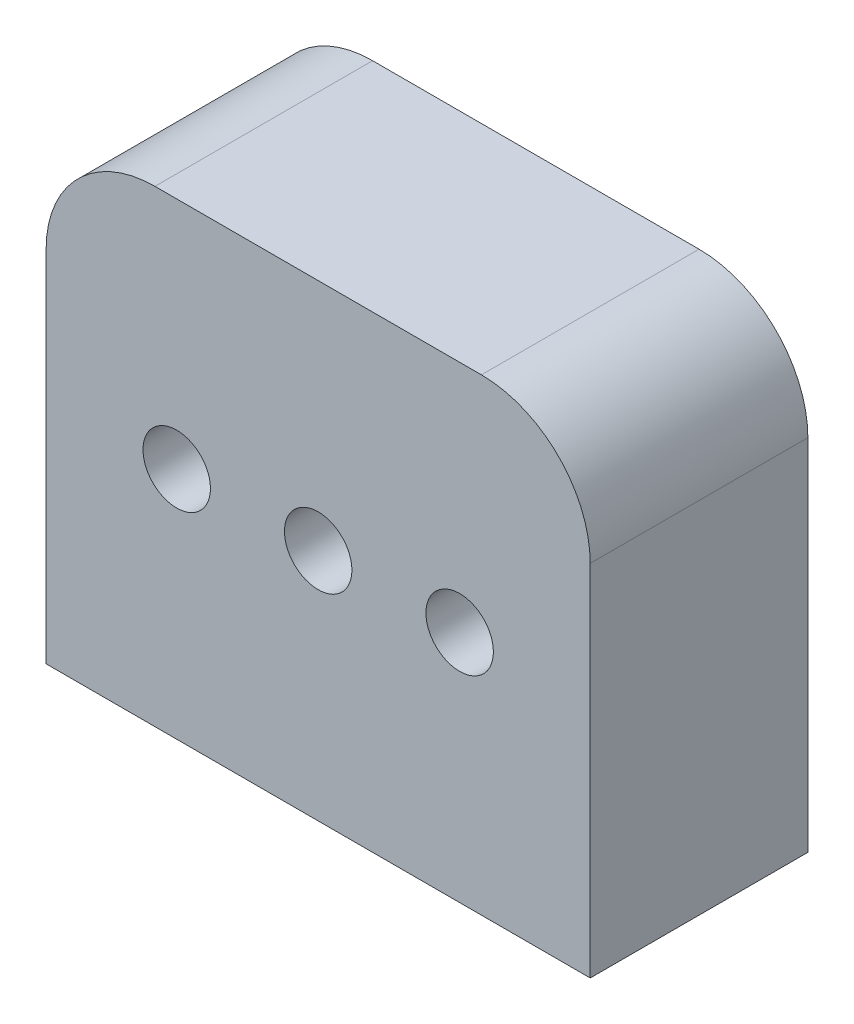
ISO-10303-21;
HEADER;
FILE_DESCRIPTION(('STEP AP214'),'2;1');
FILE_NAME('part.step','',(''),(''),'','','');
FILE_SCHEMA(('AUTOMOTIVE_DESIGN { 1 0 10303 214 1 1 1 1 }'));
ENDSEC;
DATA;
#1=APPLICATION_CONTEXT('core data for automotive mechanical design processes');
#2=APPLICATION_PROTOCOL_DEFINITION('international standard','automotive_design',2000,#1);
#3=PRODUCT_CONTEXT('',#1,'mechanical');
#4=PRODUCT('Part','Part','',(#3));
#5=PRODUCT_RELATED_PRODUCT_CATEGORY('part','',(#4));
#6=PRODUCT_DEFINITION_FORMATION('','',#4);
#7=PRODUCT_DEFINITION_CONTEXT('part definition',#1,'design');
#8=PRODUCT_DEFINITION('design','',#6,#7);
#9=PRODUCT_DEFINITION_SHAPE('','',#8);
#10=(LENGTH_UNIT() NAMED_UNIT(*) SI_UNIT(.MILLI.,.METRE.));
#11=(NAMED_UNIT(*) PLANE_ANGLE_UNIT() SI_UNIT($,.RADIAN.));
#12=(NAMED_UNIT(*) SI_UNIT($,.STERADIAN.) SOLID_ANGLE_UNIT());
#13=UNCERTAINTY_MEASURE_WITH_UNIT(LENGTH_MEASURE(1.E-05),#10,'distance_accuracy_value','');
#14=(GEOMETRIC_REPRESENTATION_CONTEXT(3) GLOBAL_UNCERTAINTY_ASSIGNED_CONTEXT((#13)) GLOBAL_UNIT_ASSIGNED_CONTEXT((#10,
#11,#12)) REPRESENTATION_CONTEXT('',''));
#15=CARTESIAN_POINT('',(0.,0.,0.));
#16=DIRECTION('',(0.,0.,1.));
#17=DIRECTION('',(1.,0.,0.));
#18=AXIS2_PLACEMENT_3D('',#15,#16,#17);
#19=CARTESIAN_POINT('',(6.35,5.461,5.08));
#20=DIRECTION('',(-1.,0.,0.));
#21=DIRECTION('',(0.,0.,1.));
#22=AXIS2_PLACEMENT_3D('',#19,#20,#21);
#23=PLANE('',#22);
#24=DIRECTION('',(0.,1.,0.));
#25=VECTOR('',#24,1.);
#26=CARTESIAN_POINT('',(6.35,5.461,0.));
#27=LINE('',#26,#25);
#28=CARTESIAN_POINT('',(6.35,-5.461,0.));
#29=VERTEX_POINT('',#28);
#30=CARTESIAN_POINT('',(6.35,2.921,0.));
#31=VERTEX_POINT('',#30);
#32=EDGE_CURVE('E116',#29,#31,#27,.T.);
#33=ORIENTED_EDGE('',*,*,#32,.T.);
#34=DIRECTION('',(0.,0.,-1.));
#35=VECTOR('',#34,1.);
#36=CARTESIAN_POINT('',(6.35,2.921,5.08));
#37=LINE('',#36,#35);
#38=CARTESIAN_POINT('',(6.35,2.921,5.08));
#39=VERTEX_POINT('',#38);
#40=EDGE_CURVE('E11',#31,#39,#37,.F.);
#41=ORIENTED_EDGE('',*,*,#40,.T.);
#42=DIRECTION('',(0.,1.,0.));
#43=VECTOR('',#42,1.);
#44=CARTESIAN_POINT('',(6.35,5.461,5.08));
#45=LINE('',#44,#43);
#46=CARTESIAN_POINT('',(6.35,-5.461,5.08));
#47=VERTEX_POINT('',#46);
#48=EDGE_CURVE('E123',#47,#39,#45,.T.);
#49=ORIENTED_EDGE('',*,*,#48,.F.);
#50=DIRECTION('',(0.,0.,-1.));
#51=VECTOR('',#50,1.);
#52=CARTESIAN_POINT('',(6.35,-5.461,5.08));
#53=LINE('',#52,#51);
#54=EDGE_CURVE('E108',#47,#29,#53,.T.);
#55=ORIENTED_EDGE('',*,*,#54,.T.);
#56=EDGE_LOOP('',(#33,#41,#49,#55));
#57=FACE_BOUND('',#56,.T.);
#58=ADVANCED_FACE('F34',(#57),#23,.F.);
#59=CARTESIAN_POINT('',(-6.35,5.461,5.08));
#60=DIRECTION('',(0.,-1.,0.));
#61=DIRECTION('',(0.,0.,-1.));
#62=AXIS2_PLACEMENT_3D('',#59,#60,#61);
#63=PLANE('',#62);
#64=DIRECTION('',(-1.,0.,0.));
#65=VECTOR('',#64,1.);
#66=CARTESIAN_POINT('',(-6.35,5.461,0.));
#67=LINE('',#66,#65);
#68=CARTESIAN_POINT('',(3.81,5.461,0.));
#69=VERTEX_POINT('',#68);
#70=CARTESIAN_POINT('',(-3.81,5.461,0.));
#71=VERTEX_POINT('',#70);
#72=EDGE_CURVE('E118',#69,#71,#67,.T.);
#73=ORIENTED_EDGE('',*,*,#72,.T.);
#74=DIRECTION('',(0.,0.,-1.));
#75=VECTOR('',#74,1.);
#76=CARTESIAN_POINT('',(-3.81,5.461,5.08));
#77=LINE('',#76,#75);
#78=CARTESIAN_POINT('',(-3.81,5.461,5.08));
#79=VERTEX_POINT('',#78);
#80=EDGE_CURVE('E55',#71,#79,#77,.F.);
#81=ORIENTED_EDGE('',*,*,#80,.T.);
#82=DIRECTION('',(-1.,0.,0.));
#83=VECTOR('',#82,1.);
#84=CARTESIAN_POINT('',(-6.35,5.461,5.08));
#85=LINE('',#84,#83);
#86=CARTESIAN_POINT('',(3.81,5.461,5.08));
#87=VERTEX_POINT('',#86);
#88=EDGE_CURVE('E98',#87,#79,#85,.T.);
#89=ORIENTED_EDGE('',*,*,#88,.F.);
#90=DIRECTION('',(0.,0.,-1.));
#91=VECTOR('',#90,1.);
#92=CARTESIAN_POINT('',(3.81,5.461,5.08));
#93=LINE('',#92,#91);
#94=EDGE_CURVE('E130',#87,#69,#93,.T.);
#95=ORIENTED_EDGE('',*,*,#94,.T.);
#96=EDGE_LOOP('',(#73,#81,#89,#95));
#97=FACE_BOUND('',#96,.T.);
#98=ADVANCED_FACE('F138',(#97),#63,.F.);
#99=CARTESIAN_POINT('',(-6.35,5.461,5.08));
#100=DIRECTION('',(1.,0.,0.));
#101=DIRECTION('',(0.,0.,-1.));
#102=AXIS2_PLACEMENT_3D('',#99,#100,#101);
#103=PLANE('',#102);
#104=DIRECTION('',(0.,-1.,0.));
#105=VECTOR('',#104,1.);
#106=CARTESIAN_POINT('',(-6.35,5.461,5.08));
#107=LINE('',#106,#105);
#108=CARTESIAN_POINT('',(-6.35,2.921,5.08));
#109=VERTEX_POINT('',#108);
#110=CARTESIAN_POINT('',(-6.35,-5.461,5.08));
#111=VERTEX_POINT('',#110);
#112=EDGE_CURVE('E88',#109,#111,#107,.T.);
#113=ORIENTED_EDGE('',*,*,#112,.F.);
#114=DIRECTION('',(0.,0.,-1.));
#115=VECTOR('',#114,1.);
#116=CARTESIAN_POINT('',(-6.35,2.921,5.08));
#117=LINE('',#116,#115);
#118=CARTESIAN_POINT('',(-6.35,2.921,0.));
#119=VERTEX_POINT('',#118);
#120=EDGE_CURVE('E107',#109,#119,#117,.T.);
#121=ORIENTED_EDGE('',*,*,#120,.T.);
#122=DIRECTION('',(0.,-1.,0.));
#123=VECTOR('',#122,1.);
#124=CARTESIAN_POINT('',(-6.35,5.461,0.));
#125=LINE('',#124,#123);
#126=CARTESIAN_POINT('',(-6.35,-5.461,0.));
#127=VERTEX_POINT('',#126);
#128=EDGE_CURVE('E104',#119,#127,#125,.T.);
#129=ORIENTED_EDGE('',*,*,#128,.T.);
#130=DIRECTION('',(0.,0.,-1.));
#131=VECTOR('',#130,1.);
#132=CARTESIAN_POINT('',(-6.35,-5.461,5.08));
#133=LINE('',#132,#131);
#134=EDGE_CURVE('E101',#111,#127,#133,.T.);
#135=ORIENTED_EDGE('',*,*,#134,.F.);
#136=EDGE_LOOP('',(#113,#121,#129,#135));
#137=FACE_BOUND('',#136,.T.);
#138=ADVANCED_FACE('F102',(#137),#103,.F.);
#139=CARTESIAN_POINT('',(-6.35,-5.461,5.08));
#140=DIRECTION('',(0.,1.,0.));
#141=DIRECTION('',(0.,0.,1.));
#142=AXIS2_PLACEMENT_3D('',#139,#140,#141);
#143=PLANE('',#142);
#144=DIRECTION('',(1.,0.,0.));
#145=VECTOR('',#144,1.);
#146=CARTESIAN_POINT('',(-6.35,-5.461,0.));
#147=LINE('',#146,#145);
#148=EDGE_CURVE('E122',#127,#29,#147,.T.);
#149=ORIENTED_EDGE('',*,*,#148,.T.);
#150=ORIENTED_EDGE('',*,*,#54,.F.);
#151=DIRECTION('',(1.,0.,0.));
#152=VECTOR('',#151,1.);
#153=CARTESIAN_POINT('',(-6.35,-5.461,5.08));
#154=LINE('',#153,#152);
#155=EDGE_CURVE('E92',#111,#47,#154,.T.);
#156=ORIENTED_EDGE('',*,*,#155,.F.);
#157=ORIENTED_EDGE('',*,*,#134,.T.);
#158=EDGE_LOOP('',(#149,#150,#156,#157));
#159=FACE_BOUND('',#158,.T.);
#160=ADVANCED_FACE('F110',(#159),#143,.F.);
#161=CARTESIAN_POINT('',(0.,0.,5.08));
#162=DIRECTION('',(0.,0.,1.));
#163=DIRECTION('',(1.,0.,0.));
#164=AXIS2_PLACEMENT_3D('',#161,#162,#163);
#165=PLANE('',#164);
#166=CARTESIAN_POINT('',(-3.302,0.,5.08));
#167=DIRECTION('',(0.,0.,1.));
#168=DIRECTION('',(1.,0.,0.));
#169=AXIS2_PLACEMENT_3D('',#166,#167,#168);
#170=CIRCLE('',#169,0.787399999999999);
#171=CARTESIAN_POINT('',(-2.5146,0.,5.08));
#172=VERTEX_POINT('',#171);
#173=EDGE_CURVE('E154',#172,#172,#170,.T.);
#174=ORIENTED_EDGE('',*,*,#173,.F.);
#175=EDGE_LOOP('',(#174));
#176=FACE_BOUND('',#175,.T.);
#177=CARTESIAN_POINT('',(3.302,0.,5.08));
#178=DIRECTION('',(0.,0.,1.));
#179=DIRECTION('',(1.,0.,0.));
#180=AXIS2_PLACEMENT_3D('',#177,#178,#179);
#181=CIRCLE('',#180,0.787399999999999);
#182=CARTESIAN_POINT('',(4.0894,0.,5.08));
#183=VERTEX_POINT('',#182);
#184=EDGE_CURVE('E148',#183,#183,#181,.T.);
#185=ORIENTED_EDGE('',*,*,#184,.F.);
#186=EDGE_LOOP('',(#185));
#187=FACE_BOUND('',#186,.T.);
#188=CARTESIAN_POINT('',(0.,0.,5.08));
#189=DIRECTION('',(0.,0.,1.));
#190=DIRECTION('',(1.,0.,0.));
#191=AXIS2_PLACEMENT_3D('',#188,#189,#190);
#192=CIRCLE('',#191,0.7874);
#193=CARTESIAN_POINT('',(0.7874,0.,5.08));
#194=VERTEX_POINT('',#193);
#195=EDGE_CURVE('E119',#194,#194,#192,.T.);
#196=ORIENTED_EDGE('',*,*,#195,.F.);
#197=EDGE_LOOP('',(#196));
#198=FACE_BOUND('',#197,.T.);
#199=ORIENTED_EDGE('',*,*,#88,.T.);
#200=CARTESIAN_POINT('',(-3.81,2.921,5.08));
#201=DIRECTION('',(0.,0.,1.));
#202=DIRECTION('',(1.,0.,0.));
#203=AXIS2_PLACEMENT_3D('',#200,#201,#202);
#204=CIRCLE('',#203,2.54);
#205=EDGE_CURVE('E42',#79,#109,#204,.T.);
#206=ORIENTED_EDGE('',*,*,#205,.T.);
#207=ORIENTED_EDGE('',*,*,#112,.T.);
#208=ORIENTED_EDGE('',*,*,#155,.T.);
#209=ORIENTED_EDGE('',*,*,#48,.T.);
#210=CARTESIAN_POINT('',(3.81,2.921,5.08));
#211=DIRECTION('',(0.,0.,1.));
#212=DIRECTION('',(1.,0.,0.));
#213=AXIS2_PLACEMENT_3D('',#210,#211,#212);
#214=CIRCLE('',#213,2.54);
#215=EDGE_CURVE('E134',#39,#87,#214,.T.);
#216=ORIENTED_EDGE('',*,*,#215,.T.);
#217=EDGE_LOOP('',(#199,#206,#207,#208,#209,#216));
#218=FACE_BOUND('',#217,.T.);
#219=ADVANCED_FACE('F90',(#176,#187,#198,#218),#165,.T.);
#220=CARTESIAN_POINT('',(0.,0.,0.));
#221=DIRECTION('',(0.,0.,1.));
#222=DIRECTION('',(1.,0.,0.));
#223=AXIS2_PLACEMENT_3D('',#220,#221,#222);
#224=PLANE('',#223);
#225=CARTESIAN_POINT('',(-3.302,0.,0.));
#226=DIRECTION('',(0.,0.,1.));
#227=DIRECTION('',(1.,0.,0.));
#228=AXIS2_PLACEMENT_3D('',#225,#226,#227);
#229=CIRCLE('',#228,0.787399999999999);
#230=CARTESIAN_POINT('',(-2.5146,0.,0.));
#231=VERTEX_POINT('',#230);
#232=EDGE_CURVE('E151',#231,#231,#229,.T.);
#233=ORIENTED_EDGE('',*,*,#232,.T.);
#234=EDGE_LOOP('',(#233));
#235=FACE_BOUND('',#234,.T.);
#236=CARTESIAN_POINT('',(3.302,0.,0.));
#237=DIRECTION('',(0.,0.,1.));
#238=DIRECTION('',(1.,0.,0.));
#239=AXIS2_PLACEMENT_3D('',#236,#237,#238);
#240=CIRCLE('',#239,0.787399999999999);
#241=CARTESIAN_POINT('',(4.0894,0.,0.));
#242=VERTEX_POINT('',#241);
#243=EDGE_CURVE('E157',#242,#242,#240,.T.);
#244=ORIENTED_EDGE('',*,*,#243,.T.);
#245=EDGE_LOOP('',(#244));
#246=FACE_BOUND('',#245,.T.);
#247=CARTESIAN_POINT('',(0.,0.,0.));
#248=DIRECTION('',(0.,0.,1.));
#249=DIRECTION('',(1.,0.,0.));
#250=AXIS2_PLACEMENT_3D('',#247,#248,#249);
#251=CIRCLE('',#250,0.7874);
#252=CARTESIAN_POINT('',(0.7874,0.,0.));
#253=VERTEX_POINT('',#252);
#254=EDGE_CURVE('E145',#253,#253,#251,.T.);
#255=ORIENTED_EDGE('',*,*,#254,.T.);
#256=EDGE_LOOP('',(#255));
#257=FACE_BOUND('',#256,.T.);
#258=ORIENTED_EDGE('',*,*,#128,.F.);
#259=CARTESIAN_POINT('',(-3.81,2.921,0.));
#260=DIRECTION('',(0.,0.,1.));
#261=DIRECTION('',(1.,0.,0.));
#262=AXIS2_PLACEMENT_3D('',#259,#260,#261);
#263=CIRCLE('',#262,2.54);
#264=EDGE_CURVE('E128',#119,#71,#263,.F.);
#265=ORIENTED_EDGE('',*,*,#264,.T.);
#266=ORIENTED_EDGE('',*,*,#72,.F.);
#267=CARTESIAN_POINT('',(3.81,2.921,0.));
#268=DIRECTION('',(0.,0.,1.));
#269=DIRECTION('',(1.,0.,0.));
#270=AXIS2_PLACEMENT_3D('',#267,#268,#269);
#271=CIRCLE('',#270,2.54);
#272=EDGE_CURVE('E126',#69,#31,#271,.F.);
#273=ORIENTED_EDGE('',*,*,#272,.T.);
#274=ORIENTED_EDGE('',*,*,#32,.F.);
#275=ORIENTED_EDGE('',*,*,#148,.F.);
#276=EDGE_LOOP('',(#258,#265,#266,#273,#274,#275));
#277=FACE_BOUND('',#276,.T.);
#278=ADVANCED_FACE('F142',(#235,#246,#257,#277),#224,.F.);
#279=CARTESIAN_POINT('',(0.,0.,5.08));
#280=DIRECTION('',(0.,0.,-1.));
#281=DIRECTION('',(-1.,0.,0.));
#282=AXIS2_PLACEMENT_3D('',#279,#280,#281);
#283=CYLINDRICAL_SURFACE('',#282,0.7874);
#284=ORIENTED_EDGE('',*,*,#195,.T.);
#285=EDGE_LOOP('',(#284));
#286=FACE_BOUND('',#285,.T.);
#287=ORIENTED_EDGE('',*,*,#254,.F.);
#288=EDGE_LOOP('',(#287));
#289=FACE_BOUND('',#288,.T.);
#290=ADVANCED_FACE('F172',(#286,#289),#283,.F.);
#291=CARTESIAN_POINT('',(3.302,0.,5.08));
#292=DIRECTION('',(0.,0.,-1.));
#293=DIRECTION('',(-1.,0.,0.));
#294=AXIS2_PLACEMENT_3D('',#291,#292,#293);
#295=CYLINDRICAL_SURFACE('',#294,0.787399999999999);
#296=ORIENTED_EDGE('',*,*,#184,.T.);
#297=EDGE_LOOP('',(#296));
#298=FACE_BOUND('',#297,.T.);
#299=ORIENTED_EDGE('',*,*,#243,.F.);
#300=EDGE_LOOP('',(#299));
#301=FACE_BOUND('',#300,.T.);
#302=ADVANCED_FACE('F163',(#298,#301),#295,.F.);
#303=CARTESIAN_POINT('',(-3.302,0.,5.08));
#304=DIRECTION('',(0.,0.,-1.));
#305=DIRECTION('',(-1.,0.,0.));
#306=AXIS2_PLACEMENT_3D('',#303,#304,#305);
#307=CYLINDRICAL_SURFACE('',#306,0.787399999999999);
#308=ORIENTED_EDGE('',*,*,#173,.T.);
#309=EDGE_LOOP('',(#308));
#310=FACE_BOUND('',#309,.T.);
#311=ORIENTED_EDGE('',*,*,#232,.F.);
#312=EDGE_LOOP('',(#311));
#313=FACE_BOUND('',#312,.T.);
#314=ADVANCED_FACE('F194',(#310,#313),#307,.F.);
#315=CARTESIAN_POINT('',(-3.81,2.921,5.08));
#316=DIRECTION('',(0.,0.,-1.));
#317=DIRECTION('',(-1.,0.,0.));
#318=AXIS2_PLACEMENT_3D('',#315,#316,#317);
#319=CYLINDRICAL_SURFACE('',#318,2.54);
#320=ORIENTED_EDGE('',*,*,#205,.F.);
#321=ORIENTED_EDGE('',*,*,#80,.F.);
#322=ORIENTED_EDGE('',*,*,#264,.F.);
#323=ORIENTED_EDGE('',*,*,#120,.F.);
#324=EDGE_LOOP('',(#320,#321,#322,#323));
#325=FACE_BOUND('',#324,.T.);
#326=ADVANCED_FACE('F192',(#325),#319,.T.);
#327=CARTESIAN_POINT('',(3.81,2.921,5.08));
#328=DIRECTION('',(0.,0.,-1.));
#329=DIRECTION('',(-1.,0.,0.));
#330=AXIS2_PLACEMENT_3D('',#327,#328,#329);
#331=CYLINDRICAL_SURFACE('',#330,2.54);
#332=ORIENTED_EDGE('',*,*,#215,.F.);
#333=ORIENTED_EDGE('',*,*,#40,.F.);
#334=ORIENTED_EDGE('',*,*,#272,.F.);
#335=ORIENTED_EDGE('',*,*,#94,.F.);
#336=EDGE_LOOP('',(#332,#333,#334,#335));
#337=FACE_BOUND('',#336,.T.);
#338=ADVANCED_FACE('F36',(#337),#331,.T.);
#339=CLOSED_SHELL('',(#58,#98,#138,#160,#219,#278,#290,#302,#314,#326,#338));
#340=MANIFOLD_SOLID_BREP('B2',#339);
#341=ADVANCED_BREP_SHAPE_REPRESENTATION('',(#18,#340),#14);
#342=SHAPE_DEFINITION_REPRESENTATION(#9,#341);
ENDSEC;
END-ISO-10303-21;
